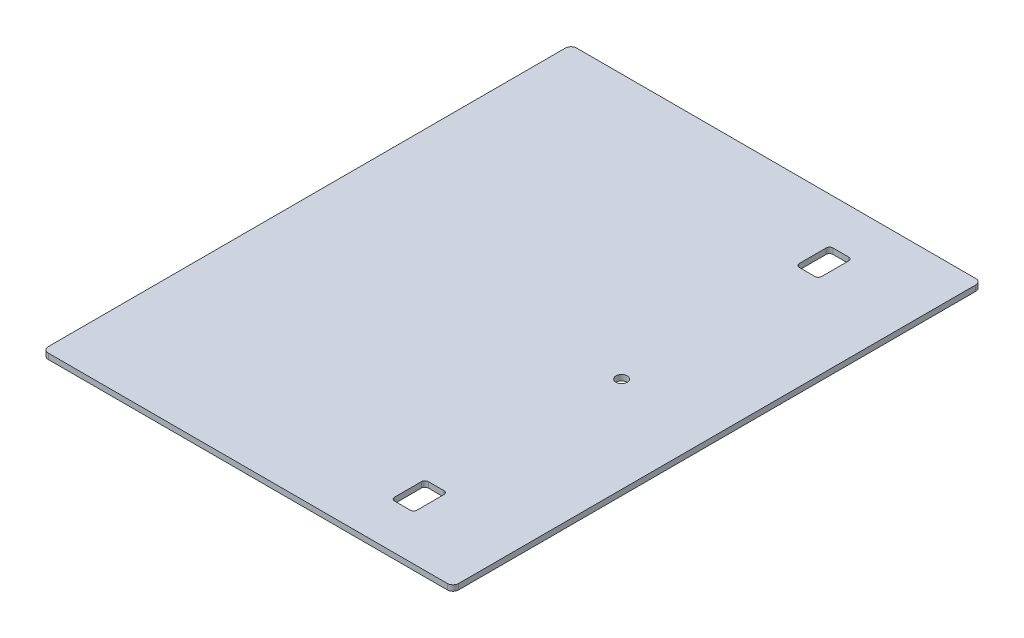
ISO-10303-21;
HEADER;
FILE_DESCRIPTION(('STEP AP214'),'2;1');
FILE_NAME('part.step','',(''),(''),'','','');
FILE_SCHEMA(('AUTOMOTIVE_DESIGN { 1 0 10303 214 1 1 1 1 }'));
ENDSEC;
DATA;
#1=APPLICATION_CONTEXT('core data for automotive mechanical design processes');
#2=APPLICATION_PROTOCOL_DEFINITION('international standard','automotive_design',2000,#1);
#3=PRODUCT_CONTEXT('',#1,'mechanical');
#4=PRODUCT('Part','Part','',(#3));
#5=PRODUCT_RELATED_PRODUCT_CATEGORY('part','',(#4));
#6=PRODUCT_DEFINITION_FORMATION('','',#4);
#7=PRODUCT_DEFINITION_CONTEXT('part definition',#1,'design');
#8=PRODUCT_DEFINITION('design','',#6,#7);
#9=PRODUCT_DEFINITION_SHAPE('','',#8);
#10=(LENGTH_UNIT() NAMED_UNIT(*) SI_UNIT(.MILLI.,.METRE.));
#11=(NAMED_UNIT(*) PLANE_ANGLE_UNIT() SI_UNIT($,.RADIAN.));
#12=(NAMED_UNIT(*) SI_UNIT($,.STERADIAN.) SOLID_ANGLE_UNIT());
#13=UNCERTAINTY_MEASURE_WITH_UNIT(LENGTH_MEASURE(1.E-05),#10,'distance_accuracy_value','');
#14=(GEOMETRIC_REPRESENTATION_CONTEXT(3) GLOBAL_UNCERTAINTY_ASSIGNED_CONTEXT((#13)) GLOBAL_UNIT_ASSIGNED_CONTEXT((#10,
#11,#12)) REPRESENTATION_CONTEXT('',''));
#15=CARTESIAN_POINT('',(0.,0.,0.));
#16=DIRECTION('',(0.,0.,1.));
#17=DIRECTION('',(1.,0.,0.));
#18=AXIS2_PLACEMENT_3D('',#15,#16,#17);
#19=CARTESIAN_POINT('',(115.8875,3.175,149.225));
#20=DIRECTION('',(-1.,0.,0.));
#21=DIRECTION('',(0.,0.,1.));
#22=AXIS2_PLACEMENT_3D('',#19,#20,#21);
#23=PLANE('',#22);
#24=DIRECTION('',(0.,0.,-1.));
#25=VECTOR('',#24,1.);
#26=CARTESIAN_POINT('',(115.8875,3.175,149.225));
#27=LINE('',#26,#25);
#28=CARTESIAN_POINT('',(115.8875,3.175,146.05));
#29=VERTEX_POINT('',#28);
#30=CARTESIAN_POINT('',(115.8875,3.175,-146.05));
#31=VERTEX_POINT('',#30);
#32=EDGE_CURVE('E255',#29,#31,#27,.T.);
#33=ORIENTED_EDGE('',*,*,#32,.F.);
#34=DIRECTION('',(0.,-1.,0.));
#35=VECTOR('',#34,1.);
#36=CARTESIAN_POINT('',(115.8875,3.175,146.05));
#37=LINE('',#36,#35);
#38=CARTESIAN_POINT('',(115.8875,0.,146.05));
#39=VERTEX_POINT('',#38);
#40=EDGE_CURVE('E297',#29,#39,#37,.T.);
#41=ORIENTED_EDGE('',*,*,#40,.T.);
#42=DIRECTION('',(0.,0.,-1.));
#43=VECTOR('',#42,1.);
#44=CARTESIAN_POINT('',(115.8875,0.,149.225));
#45=LINE('',#44,#43);
#46=CARTESIAN_POINT('',(115.8875,0.,-146.05));
#47=VERTEX_POINT('',#46);
#48=EDGE_CURVE('E465',#39,#47,#45,.T.);
#49=ORIENTED_EDGE('',*,*,#48,.T.);
#50=DIRECTION('',(0.,-1.,0.));
#51=VECTOR('',#50,1.);
#52=CARTESIAN_POINT('',(115.8875,3.175,-146.05));
#53=LINE('',#52,#51);
#54=EDGE_CURVE('E294',#47,#31,#53,.F.);
#55=ORIENTED_EDGE('',*,*,#54,.T.);
#56=EDGE_LOOP('',(#33,#41,#49,#55));
#57=FACE_BOUND('',#56,.T.);
#58=ADVANCED_FACE('F63',(#57),#23,.F.);
#59=CARTESIAN_POINT('',(-115.8875,3.175,-149.225));
#60=DIRECTION('',(0.,0.,1.));
#61=DIRECTION('',(1.,0.,0.));
#62=AXIS2_PLACEMENT_3D('',#59,#60,#61);
#63=PLANE('',#62);
#64=DIRECTION('',(-1.,0.,0.));
#65=VECTOR('',#64,1.);
#66=CARTESIAN_POINT('',(-115.8875,0.,-149.225));
#67=LINE('',#66,#65);
#68=CARTESIAN_POINT('',(112.7125,0.,-149.225));
#69=VERTEX_POINT('',#68);
#70=CARTESIAN_POINT('',(-112.7125,0.,-149.225));
#71=VERTEX_POINT('',#70);
#72=EDGE_CURVE('E264',#69,#71,#67,.T.);
#73=ORIENTED_EDGE('',*,*,#72,.T.);
#74=DIRECTION('',(0.,-1.,0.));
#75=VECTOR('',#74,1.);
#76=CARTESIAN_POINT('',(-112.7125,3.175,-149.225));
#77=LINE('',#76,#75);
#78=CARTESIAN_POINT('',(-112.7125,3.175,-149.225));
#79=VERTEX_POINT('',#78);
#80=EDGE_CURVE('E305',#71,#79,#77,.F.);
#81=ORIENTED_EDGE('',*,*,#80,.T.);
#82=DIRECTION('',(-1.,0.,0.));
#83=VECTOR('',#82,1.);
#84=CARTESIAN_POINT('',(-115.8875,3.175,-149.225));
#85=LINE('',#84,#83);
#86=CARTESIAN_POINT('',(112.7125,3.175,-149.225));
#87=VERTEX_POINT('',#86);
#88=EDGE_CURVE('E262',#87,#79,#85,.T.);
#89=ORIENTED_EDGE('',*,*,#88,.F.);
#90=DIRECTION('',(0.,-1.,0.));
#91=VECTOR('',#90,1.);
#92=CARTESIAN_POINT('',(112.7125,3.175,-149.225));
#93=LINE('',#92,#91);
#94=EDGE_CURVE('E301',#87,#69,#93,.T.);
#95=ORIENTED_EDGE('',*,*,#94,.T.);
#96=EDGE_LOOP('',(#73,#81,#89,#95));
#97=FACE_BOUND('',#96,.T.);
#98=ADVANCED_FACE('F484',(#97),#63,.F.);
#99=CARTESIAN_POINT('',(-115.8875,3.175,149.225));
#100=DIRECTION('',(1.,0.,0.));
#101=DIRECTION('',(0.,0.,-1.));
#102=AXIS2_PLACEMENT_3D('',#99,#100,#101);
#103=PLANE('',#102);
#104=DIRECTION('',(0.,0.,1.));
#105=VECTOR('',#104,1.);
#106=CARTESIAN_POINT('',(-115.8875,0.,149.225));
#107=LINE('',#106,#105);
#108=CARTESIAN_POINT('',(-115.8875,0.,-146.05));
#109=VERTEX_POINT('',#108);
#110=CARTESIAN_POINT('',(-115.8875,0.,146.05));
#111=VERTEX_POINT('',#110);
#112=EDGE_CURVE('E256',#109,#111,#107,.T.);
#113=ORIENTED_EDGE('',*,*,#112,.T.);
#114=DIRECTION('',(0.,-1.,0.));
#115=VECTOR('',#114,1.);
#116=CARTESIAN_POINT('',(-115.8875,3.175,146.05));
#117=LINE('',#116,#115);
#118=CARTESIAN_POINT('',(-115.8875,3.175,146.05));
#119=VERTEX_POINT('',#118);
#120=EDGE_CURVE('E231',#111,#119,#117,.F.);
#121=ORIENTED_EDGE('',*,*,#120,.T.);
#122=DIRECTION('',(0.,0.,1.));
#123=VECTOR('',#122,1.);
#124=CARTESIAN_POINT('',(-115.8875,3.175,149.225));
#125=LINE('',#124,#123);
#126=CARTESIAN_POINT('',(-115.8875,3.175,-146.05));
#127=VERTEX_POINT('',#126);
#128=EDGE_CURVE('E470',#127,#119,#125,.T.);
#129=ORIENTED_EDGE('',*,*,#128,.F.);
#130=DIRECTION('',(0.,-1.,0.));
#131=VECTOR('',#130,1.);
#132=CARTESIAN_POINT('',(-115.8875,3.175,-146.05));
#133=LINE('',#132,#131);
#134=EDGE_CURVE('E237',#127,#109,#133,.T.);
#135=ORIENTED_EDGE('',*,*,#134,.T.);
#136=EDGE_LOOP('',(#113,#121,#129,#135));
#137=FACE_BOUND('',#136,.T.);
#138=ADVANCED_FACE('F494',(#137),#103,.F.);
#139=CARTESIAN_POINT('',(-115.8875,3.175,149.225));
#140=DIRECTION('',(0.,0.,-1.));
#141=DIRECTION('',(-1.,0.,0.));
#142=AXIS2_PLACEMENT_3D('',#139,#140,#141);
#143=PLANE('',#142);
#144=DIRECTION('',(1.,0.,0.));
#145=VECTOR('',#144,1.);
#146=CARTESIAN_POINT('',(-115.8875,3.175,149.225));
#147=LINE('',#146,#145);
#148=CARTESIAN_POINT('',(-112.7125,3.175,149.225));
#149=VERTEX_POINT('',#148);
#150=CARTESIAN_POINT('',(112.7125,3.175,149.225));
#151=VERTEX_POINT('',#150);
#152=EDGE_CURVE('E247',#149,#151,#147,.T.);
#153=ORIENTED_EDGE('',*,*,#152,.F.);
#154=DIRECTION('',(0.,-1.,0.));
#155=VECTOR('',#154,1.);
#156=CARTESIAN_POINT('',(-112.7125,3.175,149.225));
#157=LINE('',#156,#155);
#158=CARTESIAN_POINT('',(-112.7125,0.,149.225));
#159=VERTEX_POINT('',#158);
#160=EDGE_CURVE('E230',#149,#159,#157,.T.);
#161=ORIENTED_EDGE('',*,*,#160,.T.);
#162=DIRECTION('',(1.,0.,0.));
#163=VECTOR('',#162,1.);
#164=CARTESIAN_POINT('',(-115.8875,0.,149.225));
#165=LINE('',#164,#163);
#166=CARTESIAN_POINT('',(112.7125,0.,149.225));
#167=VERTEX_POINT('',#166);
#168=EDGE_CURVE('E244',#159,#167,#165,.T.);
#169=ORIENTED_EDGE('',*,*,#168,.T.);
#170=DIRECTION('',(0.,-1.,0.));
#171=VECTOR('',#170,1.);
#172=CARTESIAN_POINT('',(112.7125,3.175,149.225));
#173=LINE('',#172,#171);
#174=EDGE_CURVE('E250',#167,#151,#173,.F.);
#175=ORIENTED_EDGE('',*,*,#174,.T.);
#176=EDGE_LOOP('',(#153,#161,#169,#175));
#177=FACE_BOUND('',#176,.T.);
#178=ADVANCED_FACE('F243',(#177),#143,.F.);
#179=CARTESIAN_POINT('',(0.,3.175,0.));
#180=DIRECTION('',(0.,-1.,0.));
#181=DIRECTION('',(0.,0.,-1.));
#182=AXIS2_PLACEMENT_3D('',#179,#180,#181);
#183=PLANE('',#182);
#184=DIRECTION('',(1.,0.,0.));
#185=VECTOR('',#184,1.);
#186=CARTESIAN_POINT('',(55.5624999999997,3.175,123.825));
#187=LINE('',#186,#185);
#188=CARTESIAN_POINT('',(57.4674999999997,3.175,123.825));
#189=VERTEX_POINT('',#188);
#190=CARTESIAN_POINT('',(66.3574999999997,3.175,123.825));
#191=VERTEX_POINT('',#190);
#192=EDGE_CURVE('E612',#189,#191,#187,.T.);
#193=ORIENTED_EDGE('',*,*,#192,.F.);
#194=CARTESIAN_POINT('',(57.4674999999997,3.175,121.92));
#195=DIRECTION('',(0.,-1.,0.));
#196=DIRECTION('',(0.,0.,-1.));
#197=AXIS2_PLACEMENT_3D('',#194,#195,#196);
#198=CIRCLE('',#197,1.905);
#199=CARTESIAN_POINT('',(55.5624999999997,3.175,121.92));
#200=VERTEX_POINT('',#199);
#201=EDGE_CURVE('E381',#189,#200,#198,.T.);
#202=ORIENTED_EDGE('',*,*,#201,.T.);
#203=DIRECTION('',(0.,0.,1.));
#204=VECTOR('',#203,1.);
#205=CARTESIAN_POINT('',(55.5624999999997,3.175,104.775));
#206=LINE('',#205,#204);
#207=CARTESIAN_POINT('',(55.5624999999997,3.175,106.68));
#208=VERTEX_POINT('',#207);
#209=EDGE_CURVE('E447',#208,#200,#206,.T.);
#210=ORIENTED_EDGE('',*,*,#209,.F.);
#211=CARTESIAN_POINT('',(57.4674999999997,3.175,106.68));
#212=DIRECTION('',(0.,-1.,0.));
#213=DIRECTION('',(0.,0.,-1.));
#214=AXIS2_PLACEMENT_3D('',#211,#212,#213);
#215=CIRCLE('',#214,1.905);
#216=CARTESIAN_POINT('',(57.4674999999997,3.175,104.775));
#217=VERTEX_POINT('',#216);
#218=EDGE_CURVE('E375',#208,#217,#215,.T.);
#219=ORIENTED_EDGE('',*,*,#218,.T.);
#220=DIRECTION('',(-1.,0.,0.));
#221=VECTOR('',#220,1.);
#222=CARTESIAN_POINT('',(55.5624999999997,3.175,104.775));
#223=LINE('',#222,#221);
#224=CARTESIAN_POINT('',(66.3574999999997,3.175,104.775));
#225=VERTEX_POINT('',#224);
#226=EDGE_CURVE('E440',#225,#217,#223,.T.);
#227=ORIENTED_EDGE('',*,*,#226,.F.);
#228=CARTESIAN_POINT('',(66.3574999999997,3.175,106.68));
#229=DIRECTION('',(0.,-1.,0.));
#230=DIRECTION('',(0.,0.,-1.));
#231=AXIS2_PLACEMENT_3D('',#228,#229,#230);
#232=CIRCLE('',#231,1.905);
#233=CARTESIAN_POINT('',(68.2624999999997,3.175,106.68));
#234=VERTEX_POINT('',#233);
#235=EDGE_CURVE('E369',#225,#234,#232,.T.);
#236=ORIENTED_EDGE('',*,*,#235,.T.);
#237=DIRECTION('',(0.,0.,-1.));
#238=VECTOR('',#237,1.);
#239=CARTESIAN_POINT('',(68.2624999999997,3.175,104.775));
#240=LINE('',#239,#238);
#241=CARTESIAN_POINT('',(68.2624999999997,3.175,121.92));
#242=VERTEX_POINT('',#241);
#243=EDGE_CURVE('E617',#242,#234,#240,.T.);
#244=ORIENTED_EDGE('',*,*,#243,.F.);
#245=CARTESIAN_POINT('',(66.3574999999997,3.175,121.92));
#246=DIRECTION('',(0.,-1.,0.));
#247=DIRECTION('',(0.,0.,-1.));
#248=AXIS2_PLACEMENT_3D('',#245,#246,#247);
#249=CIRCLE('',#248,1.905);
#250=EDGE_CURVE('E363',#242,#191,#249,.T.);
#251=ORIENTED_EDGE('',*,*,#250,.T.);
#252=EDGE_LOOP('',(#193,#202,#210,#219,#227,#236,#244,#251));
#253=FACE_BOUND('',#252,.T.);
#254=DIRECTION('',(1.,0.,0.));
#255=VECTOR('',#254,1.);
#256=CARTESIAN_POINT('',(55.5624999999997,3.175,-104.775));
#257=LINE('',#256,#255);
#258=CARTESIAN_POINT('',(57.4674999999997,3.175,-104.775));
#259=VERTEX_POINT('',#258);
#260=CARTESIAN_POINT('',(66.3574999999997,3.175,-104.775));
#261=VERTEX_POINT('',#260);
#262=EDGE_CURVE('E450',#259,#261,#257,.T.);
#263=ORIENTED_EDGE('',*,*,#262,.F.);
#264=CARTESIAN_POINT('',(57.4674999999997,3.175,-106.68));
#265=DIRECTION('',(0.,-1.,0.));
#266=DIRECTION('',(0.,0.,-1.));
#267=AXIS2_PLACEMENT_3D('',#264,#265,#266);
#268=CIRCLE('',#267,1.905);
#269=CARTESIAN_POINT('',(55.5624999999997,3.175,-106.68));
#270=VERTEX_POINT('',#269);
#271=EDGE_CURVE('E387',#259,#270,#268,.T.);
#272=ORIENTED_EDGE('',*,*,#271,.T.);
#273=DIRECTION('',(0.,0.,1.));
#274=VECTOR('',#273,1.);
#275=CARTESIAN_POINT('',(55.5624999999997,3.175,-123.825));
#276=LINE('',#275,#274);
#277=CARTESIAN_POINT('',(55.5624999999997,3.175,-121.92));
#278=VERTEX_POINT('',#277);
#279=EDGE_CURVE('E413',#278,#270,#276,.T.);
#280=ORIENTED_EDGE('',*,*,#279,.F.);
#281=CARTESIAN_POINT('',(57.4674999999997,3.175,-121.92));
#282=DIRECTION('',(0.,-1.,0.));
#283=DIRECTION('',(0.,0.,-1.));
#284=AXIS2_PLACEMENT_3D('',#281,#282,#283);
#285=CIRCLE('',#284,1.905);
#286=CARTESIAN_POINT('',(57.4674999999997,3.175,-123.825));
#287=VERTEX_POINT('',#286);
#288=EDGE_CURVE('E72',#278,#287,#285,.T.);
#289=ORIENTED_EDGE('',*,*,#288,.T.);
#290=DIRECTION('',(-1.,0.,0.));
#291=VECTOR('',#290,1.);
#292=CARTESIAN_POINT('',(55.5624999999997,3.175,-123.825));
#293=LINE('',#292,#291);
#294=CARTESIAN_POINT('',(66.3574999999997,3.175,-123.825));
#295=VERTEX_POINT('',#294);
#296=EDGE_CURVE('E411',#295,#287,#293,.T.);
#297=ORIENTED_EDGE('',*,*,#296,.F.);
#298=CARTESIAN_POINT('',(66.3574999999997,3.175,-121.92));
#299=DIRECTION('',(0.,-1.,0.));
#300=DIRECTION('',(0.,0.,-1.));
#301=AXIS2_PLACEMENT_3D('',#298,#299,#300);
#302=CIRCLE('',#301,1.905);
#303=CARTESIAN_POINT('',(68.2624999999997,3.175,-121.92));
#304=VERTEX_POINT('',#303);
#305=EDGE_CURVE('E399',#295,#304,#302,.T.);
#306=ORIENTED_EDGE('',*,*,#305,.T.);
#307=DIRECTION('',(0.,0.,-1.));
#308=VECTOR('',#307,1.);
#309=CARTESIAN_POINT('',(68.2624999999997,3.175,-123.825));
#310=LINE('',#309,#308);
#311=CARTESIAN_POINT('',(68.2624999999997,3.175,-106.68));
#312=VERTEX_POINT('',#311);
#313=EDGE_CURVE('E420',#312,#304,#310,.T.);
#314=ORIENTED_EDGE('',*,*,#313,.F.);
#315=CARTESIAN_POINT('',(66.3574999999997,3.175,-106.68));
#316=DIRECTION('',(0.,-1.,0.));
#317=DIRECTION('',(0.,0.,-1.));
#318=AXIS2_PLACEMENT_3D('',#315,#316,#317);
#319=CIRCLE('',#318,1.905);
#320=EDGE_CURVE('E393',#312,#261,#319,.T.);
#321=ORIENTED_EDGE('',*,*,#320,.T.);
#322=EDGE_LOOP('',(#263,#272,#280,#289,#297,#306,#314,#321));
#323=FACE_BOUND('',#322,.T.);
#324=CARTESIAN_POINT('',(61.9124999999997,3.175,0.));
#325=DIRECTION('',(0.,1.,0.));
#326=DIRECTION('',(0.,0.,1.));
#327=AXIS2_PLACEMENT_3D('',#324,#325,#326);
#328=CIRCLE('',#327,3.17499999999998);
#329=CARTESIAN_POINT('',(61.9124999999997,3.175,3.17499999999998));
#330=VERTEX_POINT('',#329);
#331=EDGE_CURVE('E457',#330,#330,#328,.T.);
#332=ORIENTED_EDGE('',*,*,#331,.F.);
#333=EDGE_LOOP('',(#332));
#334=FACE_BOUND('',#333,.T.);
#335=ORIENTED_EDGE('',*,*,#128,.T.);
#336=CARTESIAN_POINT('',(-112.7125,3.175,146.05));
#337=DIRECTION('',(0.,-1.,0.));
#338=DIRECTION('',(0.,0.,-1.));
#339=AXIS2_PLACEMENT_3D('',#336,#337,#338);
#340=CIRCLE('',#339,3.175);
#341=EDGE_CURVE('E291',#119,#149,#340,.F.);
#342=ORIENTED_EDGE('',*,*,#341,.T.);
#343=ORIENTED_EDGE('',*,*,#152,.T.);
#344=CARTESIAN_POINT('',(112.7125,3.175,146.05));
#345=DIRECTION('',(0.,-1.,0.));
#346=DIRECTION('',(0.,0.,-1.));
#347=AXIS2_PLACEMENT_3D('',#344,#345,#346);
#348=CIRCLE('',#347,3.175);
#349=EDGE_CURVE('E288',#151,#29,#348,.F.);
#350=ORIENTED_EDGE('',*,*,#349,.T.);
#351=ORIENTED_EDGE('',*,*,#32,.T.);
#352=CARTESIAN_POINT('',(112.7125,3.175,-146.05));
#353=DIRECTION('',(0.,-1.,0.));
#354=DIRECTION('',(0.,0.,-1.));
#355=AXIS2_PLACEMENT_3D('',#352,#353,#354);
#356=CIRCLE('',#355,3.175);
#357=EDGE_CURVE('E282',#31,#87,#356,.F.);
#358=ORIENTED_EDGE('',*,*,#357,.T.);
#359=ORIENTED_EDGE('',*,*,#88,.T.);
#360=CARTESIAN_POINT('',(-112.7125,3.175,-146.05));
#361=DIRECTION('',(0.,-1.,0.));
#362=DIRECTION('',(0.,0.,-1.));
#363=AXIS2_PLACEMENT_3D('',#360,#361,#362);
#364=CIRCLE('',#363,3.175);
#365=EDGE_CURVE('E285',#79,#127,#364,.F.);
#366=ORIENTED_EDGE('',*,*,#365,.T.);
#367=EDGE_LOOP('',(#335,#342,#343,#350,#351,#358,#359,#366));
#368=FACE_BOUND('',#367,.T.);
#369=ADVANCED_FACE('F409',(#253,#323,#334,#368),#183,.F.);
#370=CARTESIAN_POINT('',(0.,0.,0.));
#371=DIRECTION('',(0.,-1.,0.));
#372=DIRECTION('',(0.,0.,-1.));
#373=AXIS2_PLACEMENT_3D('',#370,#371,#372);
#374=PLANE('',#373);
#375=DIRECTION('',(-1.,0.,0.));
#376=VECTOR('',#375,1.);
#377=CARTESIAN_POINT('',(55.5624999999997,0.,104.775));
#378=LINE('',#377,#376);
#379=CARTESIAN_POINT('',(66.3574999999997,0.,104.775));
#380=VERTEX_POINT('',#379);
#381=CARTESIAN_POINT('',(57.4674999999997,0.,104.775));
#382=VERTEX_POINT('',#381);
#383=EDGE_CURVE('E462',#380,#382,#378,.T.);
#384=ORIENTED_EDGE('',*,*,#383,.T.);
#385=CARTESIAN_POINT('',(57.4674999999997,0.,106.68));
#386=DIRECTION('',(0.,-1.,0.));
#387=DIRECTION('',(0.,0.,-1.));
#388=AXIS2_PLACEMENT_3D('',#385,#386,#387);
#389=CIRCLE('',#388,1.905);
#390=CARTESIAN_POINT('',(55.5624999999997,0.,106.68));
#391=VERTEX_POINT('',#390);
#392=EDGE_CURVE('E378',#382,#391,#389,.F.);
#393=ORIENTED_EDGE('',*,*,#392,.T.);
#394=DIRECTION('',(0.,0.,1.));
#395=VECTOR('',#394,1.);
#396=CARTESIAN_POINT('',(55.5624999999997,0.,104.775));
#397=LINE('',#396,#395);
#398=CARTESIAN_POINT('',(55.5624999999997,0.,121.92));
#399=VERTEX_POINT('',#398);
#400=EDGE_CURVE('E607',#391,#399,#397,.T.);
#401=ORIENTED_EDGE('',*,*,#400,.T.);
#402=CARTESIAN_POINT('',(57.4674999999997,0.,121.92));
#403=DIRECTION('',(0.,-1.,0.));
#404=DIRECTION('',(0.,0.,-1.));
#405=AXIS2_PLACEMENT_3D('',#402,#403,#404);
#406=CIRCLE('',#405,1.905);
#407=CARTESIAN_POINT('',(57.4674999999997,0.,123.825));
#408=VERTEX_POINT('',#407);
#409=EDGE_CURVE('E384',#399,#408,#406,.F.);
#410=ORIENTED_EDGE('',*,*,#409,.T.);
#411=DIRECTION('',(1.,0.,0.));
#412=VECTOR('',#411,1.);
#413=CARTESIAN_POINT('',(55.5624999999997,0.,123.825));
#414=LINE('',#413,#412);
#415=CARTESIAN_POINT('',(66.3574999999997,0.,123.825));
#416=VERTEX_POINT('',#415);
#417=EDGE_CURVE('E629',#408,#416,#414,.T.);
#418=ORIENTED_EDGE('',*,*,#417,.T.);
#419=CARTESIAN_POINT('',(66.3574999999997,0.,121.92));
#420=DIRECTION('',(0.,-1.,0.));
#421=DIRECTION('',(0.,0.,-1.));
#422=AXIS2_PLACEMENT_3D('',#419,#420,#421);
#423=CIRCLE('',#422,1.905);
#424=CARTESIAN_POINT('',(68.2624999999997,0.,121.92));
#425=VERTEX_POINT('',#424);
#426=EDGE_CURVE('E366',#416,#425,#423,.F.);
#427=ORIENTED_EDGE('',*,*,#426,.T.);
#428=DIRECTION('',(0.,0.,-1.));
#429=VECTOR('',#428,1.);
#430=CARTESIAN_POINT('',(68.2624999999997,0.,104.775));
#431=LINE('',#430,#429);
#432=CARTESIAN_POINT('',(68.2624999999997,0.,106.68));
#433=VERTEX_POINT('',#432);
#434=EDGE_CURVE('E600',#425,#433,#431,.T.);
#435=ORIENTED_EDGE('',*,*,#434,.T.);
#436=CARTESIAN_POINT('',(66.3574999999997,0.,106.68));
#437=DIRECTION('',(0.,-1.,0.));
#438=DIRECTION('',(0.,0.,-1.));
#439=AXIS2_PLACEMENT_3D('',#436,#437,#438);
#440=CIRCLE('',#439,1.905);
#441=EDGE_CURVE('E372',#433,#380,#440,.F.);
#442=ORIENTED_EDGE('',*,*,#441,.T.);
#443=EDGE_LOOP('',(#384,#393,#401,#410,#418,#427,#435,#442));
#444=FACE_BOUND('',#443,.T.);
#445=DIRECTION('',(-1.,0.,0.));
#446=VECTOR('',#445,1.);
#447=CARTESIAN_POINT('',(55.5624999999997,0.,-123.825));
#448=LINE('',#447,#446);
#449=CARTESIAN_POINT('',(66.3574999999997,0.,-123.825));
#450=VERTEX_POINT('',#449);
#451=CARTESIAN_POINT('',(57.4674999999997,0.,-123.825));
#452=VERTEX_POINT('',#451);
#453=EDGE_CURVE('E427',#450,#452,#448,.T.);
#454=ORIENTED_EDGE('',*,*,#453,.T.);
#455=CARTESIAN_POINT('',(57.4674999999997,0.,-121.92));
#456=DIRECTION('',(0.,-1.,0.));
#457=DIRECTION('',(0.,0.,-1.));
#458=AXIS2_PLACEMENT_3D('',#455,#456,#457);
#459=CIRCLE('',#458,1.905);
#460=CARTESIAN_POINT('',(55.5624999999997,0.,-121.92));
#461=VERTEX_POINT('',#460);
#462=EDGE_CURVE('E12',#452,#461,#459,.F.);
#463=ORIENTED_EDGE('',*,*,#462,.T.);
#464=DIRECTION('',(0.,0.,1.));
#465=VECTOR('',#464,1.);
#466=CARTESIAN_POINT('',(55.5624999999997,0.,-123.825));
#467=LINE('',#466,#465);
#468=CARTESIAN_POINT('',(55.5624999999997,0.,-106.68));
#469=VERTEX_POINT('',#468);
#470=EDGE_CURVE('E419',#461,#469,#467,.T.);
#471=ORIENTED_EDGE('',*,*,#470,.T.);
#472=CARTESIAN_POINT('',(57.4674999999997,0.,-106.68));
#473=DIRECTION('',(0.,-1.,0.));
#474=DIRECTION('',(0.,0.,-1.));
#475=AXIS2_PLACEMENT_3D('',#472,#473,#474);
#476=CIRCLE('',#475,1.905);
#477=CARTESIAN_POINT('',(57.4674999999997,0.,-104.775));
#478=VERTEX_POINT('',#477);
#479=EDGE_CURVE('E390',#469,#478,#476,.F.);
#480=ORIENTED_EDGE('',*,*,#479,.T.);
#481=DIRECTION('',(1.,0.,0.));
#482=VECTOR('',#481,1.);
#483=CARTESIAN_POINT('',(55.5624999999997,0.,-104.775));
#484=LINE('',#483,#482);
#485=CARTESIAN_POINT('',(66.3574999999997,0.,-104.775));
#486=VERTEX_POINT('',#485);
#487=EDGE_CURVE('E432',#478,#486,#484,.T.);
#488=ORIENTED_EDGE('',*,*,#487,.T.);
#489=CARTESIAN_POINT('',(66.3574999999997,0.,-106.68));
#490=DIRECTION('',(0.,-1.,0.));
#491=DIRECTION('',(0.,0.,-1.));
#492=AXIS2_PLACEMENT_3D('',#489,#490,#491);
#493=CIRCLE('',#492,1.905);
#494=CARTESIAN_POINT('',(68.2624999999997,0.,-106.68));
#495=VERTEX_POINT('',#494);
#496=EDGE_CURVE('E396',#486,#495,#493,.F.);
#497=ORIENTED_EDGE('',*,*,#496,.T.);
#498=DIRECTION('',(0.,0.,-1.));
#499=VECTOR('',#498,1.);
#500=CARTESIAN_POINT('',(68.2624999999997,0.,-123.825));
#501=LINE('',#500,#499);
#502=CARTESIAN_POINT('',(68.2624999999997,0.,-121.92));
#503=VERTEX_POINT('',#502);
#504=EDGE_CURVE('E437',#495,#503,#501,.T.);
#505=ORIENTED_EDGE('',*,*,#504,.T.);
#506=CARTESIAN_POINT('',(66.3574999999997,0.,-121.92));
#507=DIRECTION('',(0.,-1.,0.));
#508=DIRECTION('',(0.,0.,-1.));
#509=AXIS2_PLACEMENT_3D('',#506,#507,#508);
#510=CIRCLE('',#509,1.905);
#511=EDGE_CURVE('E86',#503,#450,#510,.F.);
#512=ORIENTED_EDGE('',*,*,#511,.T.);
#513=EDGE_LOOP('',(#454,#463,#471,#480,#488,#497,#505,#512));
#514=FACE_BOUND('',#513,.T.);
#515=CARTESIAN_POINT('',(61.9124999999997,0.,0.));
#516=DIRECTION('',(0.,1.,0.));
#517=DIRECTION('',(0.,0.,1.));
#518=AXIS2_PLACEMENT_3D('',#515,#516,#517);
#519=CIRCLE('',#518,3.175);
#520=CARTESIAN_POINT('',(61.9124999999997,0.,3.175));
#521=VERTEX_POINT('',#520);
#522=EDGE_CURVE('E461',#521,#521,#519,.T.);
#523=ORIENTED_EDGE('',*,*,#522,.T.);
#524=EDGE_LOOP('',(#523));
#525=FACE_BOUND('',#524,.T.);
#526=ORIENTED_EDGE('',*,*,#168,.F.);
#527=CARTESIAN_POINT('',(-112.7125,0.,146.05));
#528=DIRECTION('',(0.,-1.,0.));
#529=DIRECTION('',(0.,0.,-1.));
#530=AXIS2_PLACEMENT_3D('',#527,#528,#529);
#531=CIRCLE('',#530,3.175);
#532=EDGE_CURVE('E226',#159,#111,#531,.T.);
#533=ORIENTED_EDGE('',*,*,#532,.T.);
#534=ORIENTED_EDGE('',*,*,#112,.F.);
#535=CARTESIAN_POINT('',(-112.7125,0.,-146.05));
#536=DIRECTION('',(0.,-1.,0.));
#537=DIRECTION('',(0.,0.,-1.));
#538=AXIS2_PLACEMENT_3D('',#535,#536,#537);
#539=CIRCLE('',#538,3.175);
#540=EDGE_CURVE('E272',#109,#71,#539,.T.);
#541=ORIENTED_EDGE('',*,*,#540,.T.);
#542=ORIENTED_EDGE('',*,*,#72,.F.);
#543=CARTESIAN_POINT('',(112.7125,0.,-146.05));
#544=DIRECTION('',(0.,-1.,0.));
#545=DIRECTION('',(0.,0.,-1.));
#546=AXIS2_PLACEMENT_3D('',#543,#544,#545);
#547=CIRCLE('',#546,3.175);
#548=EDGE_CURVE('E249',#69,#47,#547,.T.);
#549=ORIENTED_EDGE('',*,*,#548,.T.);
#550=ORIENTED_EDGE('',*,*,#48,.F.);
#551=CARTESIAN_POINT('',(112.7125,0.,146.05));
#552=DIRECTION('',(0.,-1.,0.));
#553=DIRECTION('',(0.,0.,-1.));
#554=AXIS2_PLACEMENT_3D('',#551,#552,#553);
#555=CIRCLE('',#554,3.175);
#556=EDGE_CURVE('E238',#39,#167,#555,.T.);
#557=ORIENTED_EDGE('',*,*,#556,.T.);
#558=EDGE_LOOP('',(#526,#533,#534,#541,#542,#549,#550,#557));
#559=FACE_BOUND('',#558,.T.);
#560=ADVANCED_FACE('F252',(#444,#514,#525,#559),#374,.T.);
#561=CARTESIAN_POINT('',(61.9124999999997,3.175,0.));
#562=DIRECTION('',(0.,1.,0.));
#563=DIRECTION('',(0.,0.,1.));
#564=AXIS2_PLACEMENT_3D('',#561,#562,#563);
#565=CYLINDRICAL_SURFACE('',#564,3.17499999999999);
#566=ORIENTED_EDGE('',*,*,#522,.F.);
#567=EDGE_LOOP('',(#566));
#568=FACE_BOUND('',#567,.T.);
#569=ORIENTED_EDGE('',*,*,#331,.T.);
#570=EDGE_LOOP('',(#569));
#571=FACE_BOUND('',#570,.T.);
#572=ADVANCED_FACE('F513',(#568,#571),#565,.F.);
#573=CARTESIAN_POINT('',(-112.7125,3.175,146.05));
#574=DIRECTION('',(0.,-1.,0.));
#575=DIRECTION('',(0.,0.,-1.));
#576=AXIS2_PLACEMENT_3D('',#573,#574,#575);
#577=CYLINDRICAL_SURFACE('',#576,3.175);
#578=ORIENTED_EDGE('',*,*,#341,.F.);
#579=ORIENTED_EDGE('',*,*,#120,.F.);
#580=ORIENTED_EDGE('',*,*,#532,.F.);
#581=ORIENTED_EDGE('',*,*,#160,.F.);
#582=EDGE_LOOP('',(#578,#579,#580,#581));
#583=FACE_BOUND('',#582,.T.);
#584=ADVANCED_FACE('F229',(#583),#577,.T.);
#585=CARTESIAN_POINT('',(112.7125,3.175,146.05));
#586=DIRECTION('',(0.,-1.,0.));
#587=DIRECTION('',(0.,0.,-1.));
#588=AXIS2_PLACEMENT_3D('',#585,#586,#587);
#589=CYLINDRICAL_SURFACE('',#588,3.175);
#590=ORIENTED_EDGE('',*,*,#349,.F.);
#591=ORIENTED_EDGE('',*,*,#174,.F.);
#592=ORIENTED_EDGE('',*,*,#556,.F.);
#593=ORIENTED_EDGE('',*,*,#40,.F.);
#594=EDGE_LOOP('',(#590,#591,#592,#593));
#595=FACE_BOUND('',#594,.T.);
#596=ADVANCED_FACE('F512',(#595),#589,.T.);
#597=CARTESIAN_POINT('',(-112.7125,3.175,-146.05));
#598=DIRECTION('',(0.,-1.,0.));
#599=DIRECTION('',(0.,0.,-1.));
#600=AXIS2_PLACEMENT_3D('',#597,#598,#599);
#601=CYLINDRICAL_SURFACE('',#600,3.175);
#602=ORIENTED_EDGE('',*,*,#365,.F.);
#603=ORIENTED_EDGE('',*,*,#80,.F.);
#604=ORIENTED_EDGE('',*,*,#540,.F.);
#605=ORIENTED_EDGE('',*,*,#134,.F.);
#606=EDGE_LOOP('',(#602,#603,#604,#605));
#607=FACE_BOUND('',#606,.T.);
#608=ADVANCED_FACE('F489',(#607),#601,.T.);
#609=CARTESIAN_POINT('',(112.7125,3.175,-146.05));
#610=DIRECTION('',(0.,-1.,0.));
#611=DIRECTION('',(0.,0.,-1.));
#612=AXIS2_PLACEMENT_3D('',#609,#610,#611);
#613=CYLINDRICAL_SURFACE('',#612,3.175);
#614=ORIENTED_EDGE('',*,*,#357,.F.);
#615=ORIENTED_EDGE('',*,*,#54,.F.);
#616=ORIENTED_EDGE('',*,*,#548,.F.);
#617=ORIENTED_EDGE('',*,*,#94,.F.);
#618=EDGE_LOOP('',(#614,#615,#616,#617));
#619=FACE_BOUND('',#618,.T.);
#620=ADVANCED_FACE('F519',(#619),#613,.T.);
#621=CARTESIAN_POINT('',(55.5624999999997,0.,-123.825));
#622=DIRECTION('',(-1.,0.,0.));
#623=DIRECTION('',(0.,0.,1.));
#624=AXIS2_PLACEMENT_3D('',#621,#622,#623);
#625=PLANE('',#624);
#626=ORIENTED_EDGE('',*,*,#279,.T.);
#627=DIRECTION('',(0.,1.,0.));
#628=VECTOR('',#627,1.);
#629=CARTESIAN_POINT('',(55.5624999999997,0.,-106.68));
#630=LINE('',#629,#628);
#631=EDGE_CURVE('E347',#270,#469,#630,.F.);
#632=ORIENTED_EDGE('',*,*,#631,.T.);
#633=ORIENTED_EDGE('',*,*,#470,.F.);
#634=DIRECTION('',(0.,1.,0.));
#635=VECTOR('',#634,1.);
#636=CARTESIAN_POINT('',(55.5624999999997,3.175,-121.92));
#637=LINE('',#636,#635);
#638=EDGE_CURVE('E343',#461,#278,#637,.T.);
#639=ORIENTED_EDGE('',*,*,#638,.T.);
#640=EDGE_LOOP('',(#626,#632,#633,#639));
#641=FACE_BOUND('',#640,.T.);
#642=ADVANCED_FACE('F429',(#641),#625,.F.);
#643=CARTESIAN_POINT('',(55.5624999999997,0.,-123.825));
#644=DIRECTION('',(0.,0.,-1.));
#645=DIRECTION('',(-1.,0.,0.));
#646=AXIS2_PLACEMENT_3D('',#643,#644,#645);
#647=PLANE('',#646);
#648=ORIENTED_EDGE('',*,*,#453,.F.);
#649=DIRECTION('',(0.,1.,0.));
#650=VECTOR('',#649,1.);
#651=CARTESIAN_POINT('',(66.3574999999997,3.175,-123.825));
#652=LINE('',#651,#650);
#653=EDGE_CURVE('E359',#450,#295,#652,.T.);
#654=ORIENTED_EDGE('',*,*,#653,.T.);
#655=ORIENTED_EDGE('',*,*,#296,.T.);
#656=DIRECTION('',(0.,1.,0.));
#657=VECTOR('',#656,1.);
#658=CARTESIAN_POINT('',(57.4674999999997,0.,-123.825));
#659=LINE('',#658,#657);
#660=EDGE_CURVE('E79',#287,#452,#659,.F.);
#661=ORIENTED_EDGE('',*,*,#660,.T.);
#662=EDGE_LOOP('',(#648,#654,#655,#661));
#663=FACE_BOUND('',#662,.T.);
#664=ADVANCED_FACE('F416',(#663),#647,.F.);
#665=CARTESIAN_POINT('',(68.2624999999997,0.,-123.825));
#666=DIRECTION('',(1.,0.,0.));
#667=DIRECTION('',(0.,0.,-1.));
#668=AXIS2_PLACEMENT_3D('',#665,#666,#667);
#669=PLANE('',#668);
#670=ORIENTED_EDGE('',*,*,#504,.F.);
#671=DIRECTION('',(0.,1.,0.));
#672=VECTOR('',#671,1.);
#673=CARTESIAN_POINT('',(68.2624999999997,3.175,-106.68));
#674=LINE('',#673,#672);
#675=EDGE_CURVE('E353',#495,#312,#674,.T.);
#676=ORIENTED_EDGE('',*,*,#675,.T.);
#677=ORIENTED_EDGE('',*,*,#313,.T.);
#678=DIRECTION('',(0.,1.,0.));
#679=VECTOR('',#678,1.);
#680=CARTESIAN_POINT('',(68.2624999999997,0.,-121.92));
#681=LINE('',#680,#679);
#682=EDGE_CURVE('E350',#304,#503,#681,.F.);
#683=ORIENTED_EDGE('',*,*,#682,.T.);
#684=EDGE_LOOP('',(#670,#676,#677,#683));
#685=FACE_BOUND('',#684,.T.);
#686=ADVANCED_FACE('F557',(#685),#669,.F.);
#687=CARTESIAN_POINT('',(55.5624999999997,0.,-104.775));
#688=DIRECTION('',(0.,0.,1.));
#689=DIRECTION('',(1.,0.,0.));
#690=AXIS2_PLACEMENT_3D('',#687,#688,#689);
#691=PLANE('',#690);
#692=ORIENTED_EDGE('',*,*,#487,.F.);
#693=DIRECTION('',(0.,1.,0.));
#694=VECTOR('',#693,1.);
#695=CARTESIAN_POINT('',(57.4674999999997,3.175,-104.775));
#696=LINE('',#695,#694);
#697=EDGE_CURVE('E339',#478,#259,#696,.T.);
#698=ORIENTED_EDGE('',*,*,#697,.T.);
#699=ORIENTED_EDGE('',*,*,#262,.T.);
#700=DIRECTION('',(0.,1.,0.));
#701=VECTOR('',#700,1.);
#702=CARTESIAN_POINT('',(66.3574999999997,0.,-104.775));
#703=LINE('',#702,#701);
#704=EDGE_CURVE('E336',#261,#486,#703,.F.);
#705=ORIENTED_EDGE('',*,*,#704,.T.);
#706=EDGE_LOOP('',(#692,#698,#699,#705));
#707=FACE_BOUND('',#706,.T.);
#708=ADVANCED_FACE('F563',(#707),#691,.F.);
#709=CARTESIAN_POINT('',(55.5624999999997,0.,104.775));
#710=DIRECTION('',(-1.,0.,0.));
#711=DIRECTION('',(0.,0.,1.));
#712=AXIS2_PLACEMENT_3D('',#709,#710,#711);
#713=PLANE('',#712);
#714=ORIENTED_EDGE('',*,*,#400,.F.);
#715=DIRECTION('',(0.,1.,0.));
#716=VECTOR('',#715,1.);
#717=CARTESIAN_POINT('',(55.5624999999997,3.175,106.68));
#718=LINE('',#717,#716);
#719=EDGE_CURVE('E332',#391,#208,#718,.T.);
#720=ORIENTED_EDGE('',*,*,#719,.T.);
#721=ORIENTED_EDGE('',*,*,#209,.T.);
#722=DIRECTION('',(0.,1.,0.));
#723=VECTOR('',#722,1.);
#724=CARTESIAN_POINT('',(55.5624999999997,0.,121.92));
#725=LINE('',#724,#723);
#726=EDGE_CURVE('E329',#200,#399,#725,.F.);
#727=ORIENTED_EDGE('',*,*,#726,.T.);
#728=EDGE_LOOP('',(#714,#720,#721,#727));
#729=FACE_BOUND('',#728,.T.);
#730=ADVANCED_FACE('F566',(#729),#713,.F.);
#731=CARTESIAN_POINT('',(55.5624999999997,0.,104.775));
#732=DIRECTION('',(0.,0.,-1.));
#733=DIRECTION('',(-1.,0.,0.));
#734=AXIS2_PLACEMENT_3D('',#731,#732,#733);
#735=PLANE('',#734);
#736=ORIENTED_EDGE('',*,*,#383,.F.);
#737=DIRECTION('',(0.,1.,0.));
#738=VECTOR('',#737,1.);
#739=CARTESIAN_POINT('',(66.3574999999997,3.175,104.775));
#740=LINE('',#739,#738);
#741=EDGE_CURVE('E325',#380,#225,#740,.T.);
#742=ORIENTED_EDGE('',*,*,#741,.T.);
#743=ORIENTED_EDGE('',*,*,#226,.T.);
#744=DIRECTION('',(0.,1.,0.));
#745=VECTOR('',#744,1.);
#746=CARTESIAN_POINT('',(57.4674999999997,0.,104.775));
#747=LINE('',#746,#745);
#748=EDGE_CURVE('E322',#217,#382,#747,.F.);
#749=ORIENTED_EDGE('',*,*,#748,.T.);
#750=EDGE_LOOP('',(#736,#742,#743,#749));
#751=FACE_BOUND('',#750,.T.);
#752=ADVANCED_FACE('F572',(#751),#735,.F.);
#753=CARTESIAN_POINT('',(68.2624999999997,0.,104.775));
#754=DIRECTION('',(1.,0.,0.));
#755=DIRECTION('',(0.,0.,-1.));
#756=AXIS2_PLACEMENT_3D('',#753,#754,#755);
#757=PLANE('',#756);
#758=ORIENTED_EDGE('',*,*,#434,.F.);
#759=DIRECTION('',(0.,1.,0.));
#760=VECTOR('',#759,1.);
#761=CARTESIAN_POINT('',(68.2624999999997,3.175,121.92));
#762=LINE('',#761,#760);
#763=EDGE_CURVE('E311',#425,#242,#762,.T.);
#764=ORIENTED_EDGE('',*,*,#763,.T.);
#765=ORIENTED_EDGE('',*,*,#243,.T.);
#766=DIRECTION('',(0.,1.,0.));
#767=VECTOR('',#766,1.);
#768=CARTESIAN_POINT('',(68.2624999999997,0.,106.68));
#769=LINE('',#768,#767);
#770=EDGE_CURVE('E308',#234,#433,#769,.F.);
#771=ORIENTED_EDGE('',*,*,#770,.T.);
#772=EDGE_LOOP('',(#758,#764,#765,#771));
#773=FACE_BOUND('',#772,.T.);
#774=ADVANCED_FACE('F645',(#773),#757,.F.);
#775=CARTESIAN_POINT('',(55.5624999999997,0.,123.825));
#776=DIRECTION('',(0.,0.,1.));
#777=DIRECTION('',(1.,0.,0.));
#778=AXIS2_PLACEMENT_3D('',#775,#776,#777);
#779=PLANE('',#778);
#780=ORIENTED_EDGE('',*,*,#192,.T.);
#781=DIRECTION('',(0.,1.,0.));
#782=VECTOR('',#781,1.);
#783=CARTESIAN_POINT('',(66.3574999999997,0.,123.825));
#784=LINE('',#783,#782);
#785=EDGE_CURVE('E319',#191,#416,#784,.F.);
#786=ORIENTED_EDGE('',*,*,#785,.T.);
#787=ORIENTED_EDGE('',*,*,#417,.F.);
#788=DIRECTION('',(0.,1.,0.));
#789=VECTOR('',#788,1.);
#790=CARTESIAN_POINT('',(57.4674999999997,3.175,123.825));
#791=LINE('',#790,#789);
#792=EDGE_CURVE('E315',#408,#189,#791,.T.);
#793=ORIENTED_EDGE('',*,*,#792,.T.);
#794=EDGE_LOOP('',(#780,#786,#787,#793));
#795=FACE_BOUND('',#794,.T.);
#796=ADVANCED_FACE('F527',(#795),#779,.F.);
#797=CARTESIAN_POINT('',(66.3574999999997,0.,121.92));
#798=DIRECTION('',(0.,-1.,0.));
#799=DIRECTION('',(0.,0.,-1.));
#800=AXIS2_PLACEMENT_3D('',#797,#798,#799);
#801=CYLINDRICAL_SURFACE('',#800,1.905);
#802=ORIENTED_EDGE('',*,*,#426,.F.);
#803=ORIENTED_EDGE('',*,*,#785,.F.);
#804=ORIENTED_EDGE('',*,*,#250,.F.);
#805=ORIENTED_EDGE('',*,*,#763,.F.);
#806=EDGE_LOOP('',(#802,#803,#804,#805));
#807=FACE_BOUND('',#806,.T.);
#808=ADVANCED_FACE('F523',(#807),#801,.F.);
#809=CARTESIAN_POINT('',(66.3574999999997,0.,106.68));
#810=DIRECTION('',(0.,-1.,0.));
#811=DIRECTION('',(0.,0.,-1.));
#812=AXIS2_PLACEMENT_3D('',#809,#810,#811);
#813=CYLINDRICAL_SURFACE('',#812,1.905);
#814=ORIENTED_EDGE('',*,*,#441,.F.);
#815=ORIENTED_EDGE('',*,*,#770,.F.);
#816=ORIENTED_EDGE('',*,*,#235,.F.);
#817=ORIENTED_EDGE('',*,*,#741,.F.);
#818=EDGE_LOOP('',(#814,#815,#816,#817));
#819=FACE_BOUND('',#818,.T.);
#820=ADVANCED_FACE('F526',(#819),#813,.F.);
#821=CARTESIAN_POINT('',(57.4674999999997,0.,106.68));
#822=DIRECTION('',(0.,-1.,0.));
#823=DIRECTION('',(0.,0.,-1.));
#824=AXIS2_PLACEMENT_3D('',#821,#822,#823);
#825=CYLINDRICAL_SURFACE('',#824,1.905);
#826=ORIENTED_EDGE('',*,*,#392,.F.);
#827=ORIENTED_EDGE('',*,*,#748,.F.);
#828=ORIENTED_EDGE('',*,*,#218,.F.);
#829=ORIENTED_EDGE('',*,*,#719,.F.);
#830=EDGE_LOOP('',(#826,#827,#828,#829));
#831=FACE_BOUND('',#830,.T.);
#832=ADVANCED_FACE('F531',(#831),#825,.F.);
#833=CARTESIAN_POINT('',(57.4674999999997,0.,121.92));
#834=DIRECTION('',(0.,-1.,0.));
#835=DIRECTION('',(0.,0.,-1.));
#836=AXIS2_PLACEMENT_3D('',#833,#834,#835);
#837=CYLINDRICAL_SURFACE('',#836,1.905);
#838=ORIENTED_EDGE('',*,*,#409,.F.);
#839=ORIENTED_EDGE('',*,*,#726,.F.);
#840=ORIENTED_EDGE('',*,*,#201,.F.);
#841=ORIENTED_EDGE('',*,*,#792,.F.);
#842=EDGE_LOOP('',(#838,#839,#840,#841));
#843=FACE_BOUND('',#842,.T.);
#844=ADVANCED_FACE('F535',(#843),#837,.F.);
#845=CARTESIAN_POINT('',(57.4674999999997,0.,-106.68));
#846=DIRECTION('',(0.,-1.,0.));
#847=DIRECTION('',(0.,0.,-1.));
#848=AXIS2_PLACEMENT_3D('',#845,#846,#847);
#849=CYLINDRICAL_SURFACE('',#848,1.905);
#850=ORIENTED_EDGE('',*,*,#479,.F.);
#851=ORIENTED_EDGE('',*,*,#631,.F.);
#852=ORIENTED_EDGE('',*,*,#271,.F.);
#853=ORIENTED_EDGE('',*,*,#697,.F.);
#854=EDGE_LOOP('',(#850,#851,#852,#853));
#855=FACE_BOUND('',#854,.T.);
#856=ADVANCED_FACE('F539',(#855),#849,.F.);
#857=CARTESIAN_POINT('',(66.3574999999997,0.,-106.68));
#858=DIRECTION('',(0.,-1.,0.));
#859=DIRECTION('',(0.,0.,-1.));
#860=AXIS2_PLACEMENT_3D('',#857,#858,#859);
#861=CYLINDRICAL_SURFACE('',#860,1.905);
#862=ORIENTED_EDGE('',*,*,#496,.F.);
#863=ORIENTED_EDGE('',*,*,#704,.F.);
#864=ORIENTED_EDGE('',*,*,#320,.F.);
#865=ORIENTED_EDGE('',*,*,#675,.F.);
#866=EDGE_LOOP('',(#862,#863,#864,#865));
#867=FACE_BOUND('',#866,.T.);
#868=ADVANCED_FACE('F543',(#867),#861,.F.);
#869=CARTESIAN_POINT('',(66.3574999999997,0.,-121.92));
#870=DIRECTION('',(0.,-1.,0.));
#871=DIRECTION('',(0.,0.,-1.));
#872=AXIS2_PLACEMENT_3D('',#869,#870,#871);
#873=CYLINDRICAL_SURFACE('',#872,1.905);
#874=ORIENTED_EDGE('',*,*,#511,.F.);
#875=ORIENTED_EDGE('',*,*,#682,.F.);
#876=ORIENTED_EDGE('',*,*,#305,.F.);
#877=ORIENTED_EDGE('',*,*,#653,.F.);
#878=EDGE_LOOP('',(#874,#875,#876,#877));
#879=FACE_BOUND('',#878,.T.);
#880=ADVANCED_FACE('F546',(#879),#873,.F.);
#881=CARTESIAN_POINT('',(57.4674999999997,0.,-121.92));
#882=DIRECTION('',(0.,-1.,0.));
#883=DIRECTION('',(0.,0.,-1.));
#884=AXIS2_PLACEMENT_3D('',#881,#882,#883);
#885=CYLINDRICAL_SURFACE('',#884,1.905);
#886=ORIENTED_EDGE('',*,*,#462,.F.);
#887=ORIENTED_EDGE('',*,*,#660,.F.);
#888=ORIENTED_EDGE('',*,*,#288,.F.);
#889=ORIENTED_EDGE('',*,*,#638,.F.);
#890=EDGE_LOOP('',(#886,#887,#888,#889));
#891=FACE_BOUND('',#890,.T.);
#892=ADVANCED_FACE('F65',(#891),#885,.F.);
#893=CLOSED_SHELL('',(#58,#98,#138,#178,#369,#560,#572,#584,#596,#608,#620,#642,#664,#686,#708,
#730,#752,#774,#796,#808,#820,#832,#844,#856,#868,#880,#892));
#894=MANIFOLD_SOLID_BREP('B2',#893);
#895=ADVANCED_BREP_SHAPE_REPRESENTATION('',(#18,#894),#14);
#896=SHAPE_DEFINITION_REPRESENTATION(#9,#895);
ENDSEC;
END-ISO-10303-21;
